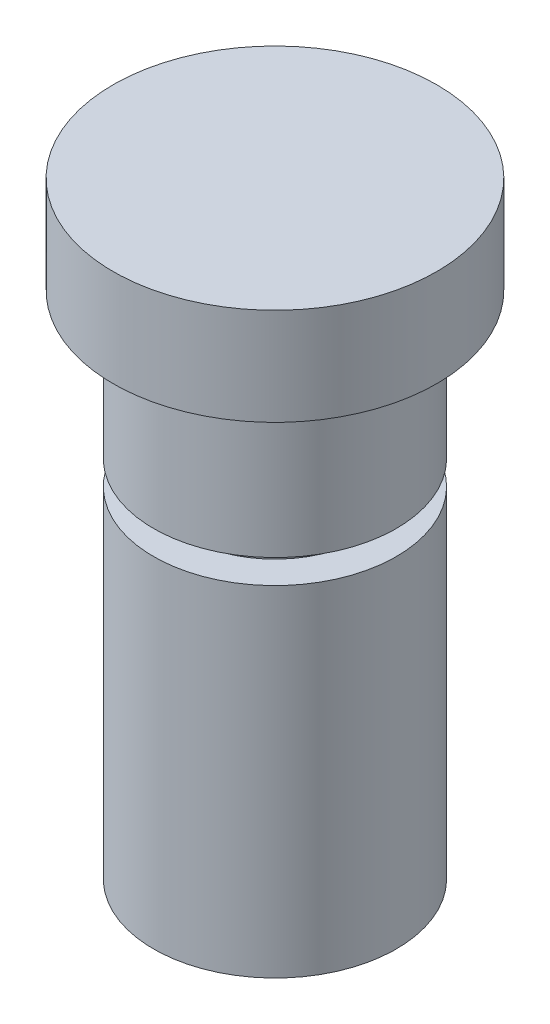
ISO-10303-21;
HEADER;
FILE_DESCRIPTION(('STEP AP214'),'2;1');
FILE_NAME('part.step','',(''),(''),'','','');
FILE_SCHEMA(('AUTOMOTIVE_DESIGN { 1 0 10303 214 1 1 1 1 }'));
ENDSEC;
DATA;
#1=APPLICATION_CONTEXT('core data for automotive mechanical design processes');
#2=APPLICATION_PROTOCOL_DEFINITION('international standard','automotive_design',2000,#1);
#3=PRODUCT_CONTEXT('',#1,'mechanical');
#4=PRODUCT('Part','Part','',(#3));
#5=PRODUCT_RELATED_PRODUCT_CATEGORY('part','',(#4));
#6=PRODUCT_DEFINITION_FORMATION('','',#4);
#7=PRODUCT_DEFINITION_CONTEXT('part definition',#1,'design');
#8=PRODUCT_DEFINITION('design','',#6,#7);
#9=PRODUCT_DEFINITION_SHAPE('','',#8);
#10=(LENGTH_UNIT() NAMED_UNIT(*) SI_UNIT(.MILLI.,.METRE.));
#11=(NAMED_UNIT(*) PLANE_ANGLE_UNIT() SI_UNIT($,.RADIAN.));
#12=(NAMED_UNIT(*) SI_UNIT($,.STERADIAN.) SOLID_ANGLE_UNIT());
#13=UNCERTAINTY_MEASURE_WITH_UNIT(LENGTH_MEASURE(1.E-05),#10,'distance_accuracy_value','');
#14=(GEOMETRIC_REPRESENTATION_CONTEXT(3) GLOBAL_UNCERTAINTY_ASSIGNED_CONTEXT((#13)) GLOBAL_UNIT_ASSIGNED_CONTEXT((#10,
#11,#12)) REPRESENTATION_CONTEXT('',''));
#15=CARTESIAN_POINT('',(0.,0.,0.));
#16=DIRECTION('',(0.,0.,1.));
#17=DIRECTION('',(1.,0.,0.));
#18=AXIS2_PLACEMENT_3D('',#15,#16,#17);
#19=CARTESIAN_POINT('',(0.,-45.,0.));
#20=DIRECTION('',(0.,-1.,0.));
#21=DIRECTION('',(0.,0.,-1.));
#22=AXIS2_PLACEMENT_3D('',#19,#20,#21);
#23=PLANE('',#22);
#24=CARTESIAN_POINT('',(0.,-45.,0.));
#25=DIRECTION('',(0.,-1.,0.));
#26=DIRECTION('',(0.,0.,-1.));
#27=AXIS2_PLACEMENT_3D('',#24,#25,#26);
#28=CIRCLE('',#27,15.);
#29=CARTESIAN_POINT('',(0.,-45.,-15.));
#30=VERTEX_POINT('',#29);
#31=EDGE_CURVE('E10',#30,#30,#28,.T.);
#32=ORIENTED_EDGE('',*,*,#31,.T.);
#33=EDGE_LOOP('',(#32));
#34=FACE_BOUND('',#33,.T.);
#35=ADVANCED_FACE('F40',(#34),#23,.T.);
#36=CARTESIAN_POINT('',(0.,-50.,0.));
#37=DIRECTION('',(0.,-1.,0.));
#38=DIRECTION('',(0.,0.,-1.));
#39=AXIS2_PLACEMENT_3D('',#36,#37,#38);
#40=CYLINDRICAL_SURFACE('',#39,15.);
#41=CARTESIAN_POINT('',(0.,-3.,0.));
#42=DIRECTION('',(0.,-1.,0.));
#43=DIRECTION('',(0.,0.,-1.));
#44=AXIS2_PLACEMENT_3D('',#41,#42,#43);
#45=CIRCLE('',#44,15.);
#46=CARTESIAN_POINT('',(0.,-3.,-15.));
#47=VERTEX_POINT('',#46);
#48=EDGE_CURVE('E43',#47,#47,#45,.T.);
#49=ORIENTED_EDGE('',*,*,#48,.T.);
#50=EDGE_LOOP('',(#49));
#51=FACE_BOUND('',#50,.T.);
#52=ORIENTED_EDGE('',*,*,#31,.F.);
#53=EDGE_LOOP('',(#52));
#54=FACE_BOUND('',#53,.T.);
#55=ADVANCED_FACE('F83',(#51,#54),#40,.T.);
#56=CARTESIAN_POINT('',(15.,-3.,0.));
#57=DIRECTION('',(0.,1.,0.));
#58=DIRECTION('',(0.,0.,1.));
#59=AXIS2_PLACEMENT_3D('',#56,#57,#58);
#60=PLANE('',#59);
#61=CARTESIAN_POINT('',(0.,-3.,0.));
#62=DIRECTION('',(0.,-1.,0.));
#63=DIRECTION('',(0.,0.,-1.));
#64=AXIS2_PLACEMENT_3D('',#61,#62,#63);
#65=CIRCLE('',#64,11.);
#66=CARTESIAN_POINT('',(0.,-3.,-11.));
#67=VERTEX_POINT('',#66);
#68=EDGE_CURVE('E50',#67,#67,#65,.T.);
#69=ORIENTED_EDGE('',*,*,#68,.T.);
#70=EDGE_LOOP('',(#69));
#71=FACE_BOUND('',#70,.T.);
#72=ORIENTED_EDGE('',*,*,#48,.F.);
#73=EDGE_LOOP('',(#72));
#74=FACE_BOUND('',#73,.T.);
#75=ADVANCED_FACE('F82',(#71,#74),#60,.T.);
#76=CARTESIAN_POINT('',(0.,-50.,0.));
#77=DIRECTION('',(0.,-1.,0.));
#78=DIRECTION('',(0.,0.,-1.));
#79=AXIS2_PLACEMENT_3D('',#76,#77,#78);
#80=CYLINDRICAL_SURFACE('',#79,11.);
#81=CARTESIAN_POINT('',(0.,0.,0.));
#82=DIRECTION('',(0.,-1.,0.));
#83=DIRECTION('',(0.,0.,-1.));
#84=AXIS2_PLACEMENT_3D('',#81,#82,#83);
#85=CIRCLE('',#84,11.);
#86=CARTESIAN_POINT('',(0.,0.,-11.));
#87=VERTEX_POINT('',#86);
#88=EDGE_CURVE('E51',#87,#87,#85,.T.);
#89=ORIENTED_EDGE('',*,*,#88,.T.);
#90=EDGE_LOOP('',(#89));
#91=FACE_BOUND('',#90,.T.);
#92=ORIENTED_EDGE('',*,*,#68,.F.);
#93=EDGE_LOOP('',(#92));
#94=FACE_BOUND('',#93,.T.);
#95=ADVANCED_FACE('F87',(#91,#94),#80,.T.);
#96=CARTESIAN_POINT('',(11.,0.,0.));
#97=DIRECTION('',(0.,-1.,0.));
#98=DIRECTION('',(0.,0.,-1.));
#99=AXIS2_PLACEMENT_3D('',#96,#97,#98);
#100=PLANE('',#99);
#101=CARTESIAN_POINT('',(0.,0.,0.));
#102=DIRECTION('',(0.,-1.,0.));
#103=DIRECTION('',(0.,0.,-1.));
#104=AXIS2_PLACEMENT_3D('',#101,#102,#103);
#105=CIRCLE('',#104,15.);
#106=CARTESIAN_POINT('',(0.,0.,-15.));
#107=VERTEX_POINT('',#106);
#108=EDGE_CURVE('E57',#107,#107,#105,.T.);
#109=ORIENTED_EDGE('',*,*,#108,.T.);
#110=EDGE_LOOP('',(#109));
#111=FACE_BOUND('',#110,.T.);
#112=ORIENTED_EDGE('',*,*,#88,.F.);
#113=EDGE_LOOP('',(#112));
#114=FACE_BOUND('',#113,.T.);
#115=ADVANCED_FACE('F96',(#111,#114),#100,.T.);
#116=CARTESIAN_POINT('',(0.,-50.,0.));
#117=DIRECTION('',(0.,-1.,0.));
#118=DIRECTION('',(0.,0.,-1.));
#119=AXIS2_PLACEMENT_3D('',#116,#117,#118);
#120=CYLINDRICAL_SURFACE('',#119,15.);
#121=CARTESIAN_POINT('',(0.,18.,0.));
#122=DIRECTION('',(0.,-1.,0.));
#123=DIRECTION('',(0.,0.,-1.));
#124=AXIS2_PLACEMENT_3D('',#121,#122,#123);
#125=CIRCLE('',#124,15.);
#126=CARTESIAN_POINT('',(0.,18.,-15.));
#127=VERTEX_POINT('',#126);
#128=EDGE_CURVE('E56',#127,#127,#125,.T.);
#129=ORIENTED_EDGE('',*,*,#128,.T.);
#130=EDGE_LOOP('',(#129));
#131=FACE_BOUND('',#130,.T.);
#132=ORIENTED_EDGE('',*,*,#108,.F.);
#133=EDGE_LOOP('',(#132));
#134=FACE_BOUND('',#133,.T.);
#135=ADVANCED_FACE('F99',(#131,#134),#120,.T.);
#136=CARTESIAN_POINT('',(15.,18.,0.));
#137=DIRECTION('',(0.,-1.,0.));
#138=DIRECTION('',(0.,0.,-1.));
#139=AXIS2_PLACEMENT_3D('',#136,#137,#138);
#140=PLANE('',#139);
#141=CARTESIAN_POINT('',(0.,18.,0.));
#142=DIRECTION('',(0.,-1.,0.));
#143=DIRECTION('',(0.,0.,-1.));
#144=AXIS2_PLACEMENT_3D('',#141,#142,#143);
#145=CIRCLE('',#144,20.);
#146=CARTESIAN_POINT('',(0.,18.,-20.));
#147=VERTEX_POINT('',#146);
#148=EDGE_CURVE('E64',#147,#147,#145,.T.);
#149=ORIENTED_EDGE('',*,*,#148,.T.);
#150=EDGE_LOOP('',(#149));
#151=FACE_BOUND('',#150,.T.);
#152=ORIENTED_EDGE('',*,*,#128,.F.);
#153=EDGE_LOOP('',(#152));
#154=FACE_BOUND('',#153,.T.);
#155=ADVANCED_FACE('F76',(#151,#154),#140,.T.);
#156=CARTESIAN_POINT('',(0.,-50.,0.));
#157=DIRECTION('',(0.,-1.,0.));
#158=DIRECTION('',(0.,0.,-1.));
#159=AXIS2_PLACEMENT_3D('',#156,#157,#158);
#160=CYLINDRICAL_SURFACE('',#159,20.);
#161=CARTESIAN_POINT('',(0.,30.,0.));
#162=DIRECTION('',(0.,-1.,0.));
#163=DIRECTION('',(0.,0.,-1.));
#164=AXIS2_PLACEMENT_3D('',#161,#162,#163);
#165=CIRCLE('',#164,20.);
#166=CARTESIAN_POINT('',(0.,30.,-20.));
#167=VERTEX_POINT('',#166);
#168=EDGE_CURVE('E63',#167,#167,#165,.T.);
#169=ORIENTED_EDGE('',*,*,#168,.T.);
#170=EDGE_LOOP('',(#169));
#171=FACE_BOUND('',#170,.T.);
#172=ORIENTED_EDGE('',*,*,#148,.F.);
#173=EDGE_LOOP('',(#172));
#174=FACE_BOUND('',#173,.T.);
#175=ADVANCED_FACE('F69',(#171,#174),#160,.T.);
#176=CARTESIAN_POINT('',(20.,30.,0.));
#177=DIRECTION('',(0.,1.,0.));
#178=DIRECTION('',(0.,0.,1.));
#179=AXIS2_PLACEMENT_3D('',#176,#177,#178);
#180=PLANE('',#179);
#181=ORIENTED_EDGE('',*,*,#168,.F.);
#182=EDGE_LOOP('',(#181));
#183=FACE_BOUND('',#182,.T.);
#184=ADVANCED_FACE('F74',(#183),#180,.T.);
#185=CLOSED_SHELL('',(#35,#55,#75,#95,#115,#135,#155,#175,#184));
#186=MANIFOLD_SOLID_BREP('B2',#185);
#187=ADVANCED_BREP_SHAPE_REPRESENTATION('',(#18,#186),#14);
#188=SHAPE_DEFINITION_REPRESENTATION(#9,#187);
ENDSEC;
END-ISO-10303-21;
